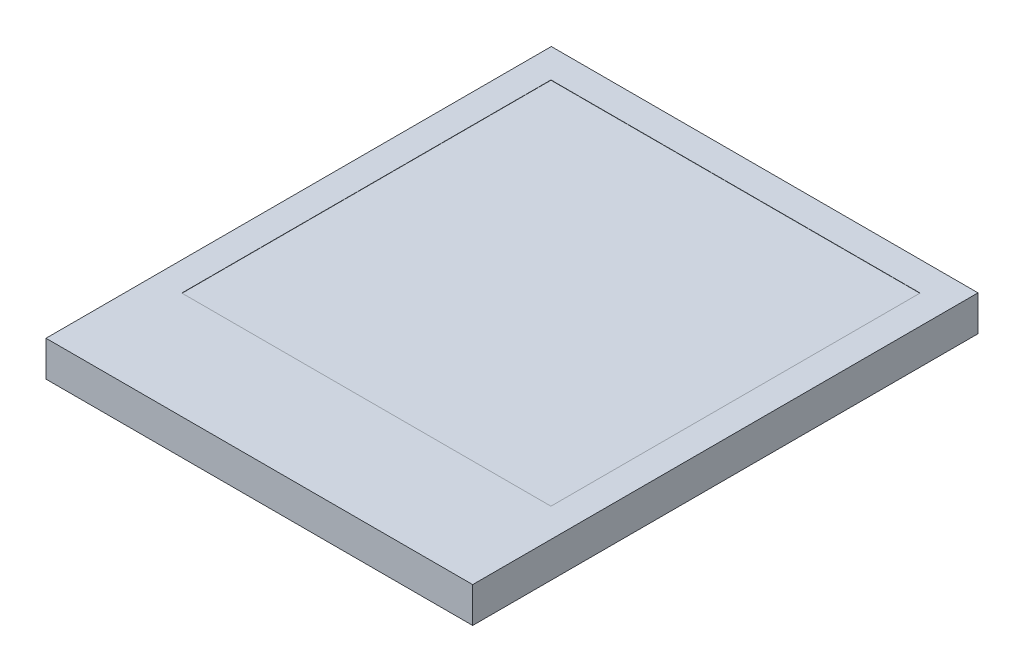
ISO-10303-21;
HEADER;
FILE_DESCRIPTION(('STEP AP214'),'2;1');
FILE_NAME('part.step','',(''),(''),'','','');
FILE_SCHEMA(('AUTOMOTIVE_DESIGN { 1 0 10303 214 1 1 1 1 }'));
ENDSEC;
DATA;
#1=APPLICATION_CONTEXT('core data for automotive mechanical design processes');
#2=APPLICATION_PROTOCOL_DEFINITION('international standard','automotive_design',2000,#1);
#3=PRODUCT_CONTEXT('',#1,'mechanical');
#4=PRODUCT('Part','Part','',(#3));
#5=PRODUCT_RELATED_PRODUCT_CATEGORY('part','',(#4));
#6=PRODUCT_DEFINITION_FORMATION('','',#4);
#7=PRODUCT_DEFINITION_CONTEXT('part definition',#1,'design');
#8=PRODUCT_DEFINITION('design','',#6,#7);
#9=PRODUCT_DEFINITION_SHAPE('','',#8);
#10=(LENGTH_UNIT() NAMED_UNIT(*) SI_UNIT(.MILLI.,.METRE.));
#11=(NAMED_UNIT(*) PLANE_ANGLE_UNIT() SI_UNIT($,.RADIAN.));
#12=(NAMED_UNIT(*) SI_UNIT($,.STERADIAN.) SOLID_ANGLE_UNIT());
#13=UNCERTAINTY_MEASURE_WITH_UNIT(LENGTH_MEASURE(1.E-05),#10,'distance_accuracy_value','');
#14=(GEOMETRIC_REPRESENTATION_CONTEXT(3) GLOBAL_UNCERTAINTY_ASSIGNED_CONTEXT((#13)) GLOBAL_UNIT_ASSIGNED_CONTEXT((#10,
#11,#12)) REPRESENTATION_CONTEXT('',''));
#15=CARTESIAN_POINT('',(0.,0.,0.));
#16=DIRECTION('',(0.,0.,1.));
#17=DIRECTION('',(1.,0.,0.));
#18=AXIS2_PLACEMENT_3D('',#15,#16,#17);
#19=CARTESIAN_POINT('',(0.,1.46,0.));
#20=DIRECTION('',(1.,0.,0.));
#21=DIRECTION('',(0.,0.,-1.));
#22=AXIS2_PLACEMENT_3D('',#19,#20,#21);
#23=PLANE('',#22);
#24=DIRECTION('',(0.,0.,1.));
#25=VECTOR('',#24,1.);
#26=CARTESIAN_POINT('',(0.,0.,0.));
#27=LINE('',#26,#25);
#28=CARTESIAN_POINT('',(0.,0.,-20.82));
#29=VERTEX_POINT('',#28);
#30=CARTESIAN_POINT('',(0.,0.,0.));
#31=VERTEX_POINT('',#30);
#32=EDGE_CURVE('E147',#29,#31,#27,.T.);
#33=ORIENTED_EDGE('',*,*,#32,.T.);
#34=DIRECTION('',(0.,-1.,0.));
#35=VECTOR('',#34,1.);
#36=CARTESIAN_POINT('',(0.,1.46,0.));
#37=LINE('',#36,#35);
#38=CARTESIAN_POINT('',(0.,1.46,0.));
#39=VERTEX_POINT('',#38);
#40=EDGE_CURVE('E11',#39,#31,#37,.T.);
#41=ORIENTED_EDGE('',*,*,#40,.F.);
#42=DIRECTION('',(0.,0.,1.));
#43=VECTOR('',#42,1.);
#44=CARTESIAN_POINT('',(0.,1.46,0.));
#45=LINE('',#44,#43);
#46=CARTESIAN_POINT('',(0.,1.46,-20.82));
#47=VERTEX_POINT('',#46);
#48=EDGE_CURVE('E151',#47,#39,#45,.T.);
#49=ORIENTED_EDGE('',*,*,#48,.F.);
#50=DIRECTION('',(0.,-1.,0.));
#51=VECTOR('',#50,1.);
#52=CARTESIAN_POINT('',(0.,1.46,-20.82));
#53=LINE('',#52,#51);
#54=EDGE_CURVE('E157',#47,#29,#53,.T.);
#55=ORIENTED_EDGE('',*,*,#54,.T.);
#56=EDGE_LOOP('',(#33,#41,#49,#55));
#57=FACE_BOUND('',#56,.T.);
#58=ADVANCED_FACE('F39',(#57),#23,.F.);
#59=CARTESIAN_POINT('',(0.,1.46,0.));
#60=DIRECTION('',(0.,0.,-1.));
#61=DIRECTION('',(-1.,0.,0.));
#62=AXIS2_PLACEMENT_3D('',#59,#60,#61);
#63=PLANE('',#62);
#64=DIRECTION('',(1.,0.,0.));
#65=VECTOR('',#64,1.);
#66=CARTESIAN_POINT('',(0.,0.,0.));
#67=LINE('',#66,#65);
#68=CARTESIAN_POINT('',(17.58,0.,0.));
#69=VERTEX_POINT('',#68);
#70=EDGE_CURVE('E160',#31,#69,#67,.T.);
#71=ORIENTED_EDGE('',*,*,#70,.T.);
#72=DIRECTION('',(0.,-1.,0.));
#73=VECTOR('',#72,1.);
#74=CARTESIAN_POINT('',(17.58,1.46,0.));
#75=LINE('',#74,#73);
#76=CARTESIAN_POINT('',(17.58,1.46,0.));
#77=VERTEX_POINT('',#76);
#78=EDGE_CURVE('E46',#77,#69,#75,.T.);
#79=ORIENTED_EDGE('',*,*,#78,.F.);
#80=DIRECTION('',(1.,0.,0.));
#81=VECTOR('',#80,1.);
#82=CARTESIAN_POINT('',(0.,1.46,0.));
#83=LINE('',#82,#81);
#84=EDGE_CURVE('E90',#39,#77,#83,.T.);
#85=ORIENTED_EDGE('',*,*,#84,.F.);
#86=ORIENTED_EDGE('',*,*,#40,.T.);
#87=EDGE_LOOP('',(#71,#79,#85,#86));
#88=FACE_BOUND('',#87,.T.);
#89=ADVANCED_FACE('F189',(#88),#63,.F.);
#90=CARTESIAN_POINT('',(17.58,1.46,0.));
#91=DIRECTION('',(-1.,0.,0.));
#92=DIRECTION('',(0.,0.,1.));
#93=AXIS2_PLACEMENT_3D('',#90,#91,#92);
#94=PLANE('',#93);
#95=DIRECTION('',(0.,0.,-1.));
#96=VECTOR('',#95,1.);
#97=CARTESIAN_POINT('',(17.58,0.,0.));
#98=LINE('',#97,#96);
#99=CARTESIAN_POINT('',(17.58,0.,-20.82));
#100=VERTEX_POINT('',#99);
#101=EDGE_CURVE('E162',#69,#100,#98,.T.);
#102=ORIENTED_EDGE('',*,*,#101,.T.);
#103=DIRECTION('',(0.,-1.,0.));
#104=VECTOR('',#103,1.);
#105=CARTESIAN_POINT('',(17.58,1.46,-20.82));
#106=LINE('',#105,#104);
#107=CARTESIAN_POINT('',(17.58,1.46,-20.82));
#108=VERTEX_POINT('',#107);
#109=EDGE_CURVE('E166',#108,#100,#106,.T.);
#110=ORIENTED_EDGE('',*,*,#109,.F.);
#111=DIRECTION('',(0.,0.,-1.));
#112=VECTOR('',#111,1.);
#113=CARTESIAN_POINT('',(17.58,1.46,0.));
#114=LINE('',#113,#112);
#115=EDGE_CURVE('E154',#77,#108,#114,.T.);
#116=ORIENTED_EDGE('',*,*,#115,.F.);
#117=ORIENTED_EDGE('',*,*,#78,.T.);
#118=EDGE_LOOP('',(#102,#110,#116,#117));
#119=FACE_BOUND('',#118,.T.);
#120=ADVANCED_FACE('F171',(#119),#94,.F.);
#121=CARTESIAN_POINT('',(0.,1.46,-20.82));
#122=DIRECTION('',(0.,0.,1.));
#123=DIRECTION('',(1.,0.,0.));
#124=AXIS2_PLACEMENT_3D('',#121,#122,#123);
#125=PLANE('',#124);
#126=DIRECTION('',(-1.,0.,0.));
#127=VECTOR('',#126,1.);
#128=CARTESIAN_POINT('',(0.,0.,-20.82));
#129=LINE('',#128,#127);
#130=EDGE_CURVE('E83',#100,#29,#129,.T.);
#131=ORIENTED_EDGE('',*,*,#130,.T.);
#132=ORIENTED_EDGE('',*,*,#54,.F.);
#133=DIRECTION('',(-1.,0.,0.));
#134=VECTOR('',#133,1.);
#135=CARTESIAN_POINT('',(0.,1.46,-20.82));
#136=LINE('',#135,#134);
#137=EDGE_CURVE('E62',#108,#47,#136,.T.);
#138=ORIENTED_EDGE('',*,*,#137,.F.);
#139=ORIENTED_EDGE('',*,*,#109,.T.);
#140=EDGE_LOOP('',(#131,#132,#138,#139));
#141=FACE_BOUND('',#140,.T.);
#142=ADVANCED_FACE('F179',(#141),#125,.F.);
#143=CARTESIAN_POINT('',(0.,1.46,0.));
#144=DIRECTION('',(0.,-1.,0.));
#145=DIRECTION('',(0.,0.,-1.));
#146=AXIS2_PLACEMENT_3D('',#143,#144,#145);
#147=PLANE('',#146);
#148=DIRECTION('',(1.,0.,0.));
#149=VECTOR('',#148,1.);
#150=CARTESIAN_POINT('',(1.185,1.46,-4.41));
#151=LINE('',#150,#149);
#152=CARTESIAN_POINT('',(1.185,1.46,-4.41));
#153=VERTEX_POINT('',#152);
#154=CARTESIAN_POINT('',(16.395,1.46,-4.41));
#155=VERTEX_POINT('',#154);
#156=EDGE_CURVE('E141',#153,#155,#151,.T.);
#157=ORIENTED_EDGE('',*,*,#156,.F.);
#158=DIRECTION('',(0.,0.,1.));
#159=VECTOR('',#158,1.);
#160=CARTESIAN_POINT('',(1.185,1.46,-19.62));
#161=LINE('',#160,#159);
#162=CARTESIAN_POINT('',(1.185,1.46,-19.62));
#163=VERTEX_POINT('',#162);
#164=EDGE_CURVE('E53',#163,#153,#161,.T.);
#165=ORIENTED_EDGE('',*,*,#164,.F.);
#166=DIRECTION('',(-1.,0.,0.));
#167=VECTOR('',#166,1.);
#168=CARTESIAN_POINT('',(1.185,1.46,-19.62));
#169=LINE('',#168,#167);
#170=CARTESIAN_POINT('',(16.395,1.46,-19.62));
#171=VERTEX_POINT('',#170);
#172=EDGE_CURVE('E132',#171,#163,#169,.T.);
#173=ORIENTED_EDGE('',*,*,#172,.F.);
#174=DIRECTION('',(0.,0.,-1.));
#175=VECTOR('',#174,1.);
#176=CARTESIAN_POINT('',(16.395,1.46,-19.62));
#177=LINE('',#176,#175);
#178=EDGE_CURVE('E135',#155,#171,#177,.T.);
#179=ORIENTED_EDGE('',*,*,#178,.F.);
#180=EDGE_LOOP('',(#157,#165,#173,#179));
#181=FACE_BOUND('',#180,.T.);
#182=ORIENTED_EDGE('',*,*,#48,.T.);
#183=ORIENTED_EDGE('',*,*,#84,.T.);
#184=ORIENTED_EDGE('',*,*,#115,.T.);
#185=ORIENTED_EDGE('',*,*,#137,.T.);
#186=EDGE_LOOP('',(#182,#183,#184,#185));
#187=FACE_BOUND('',#186,.T.);
#188=ADVANCED_FACE('F181',(#181,#187),#147,.F.);
#189=CARTESIAN_POINT('',(0.,0.,0.));
#190=DIRECTION('',(0.,-1.,0.));
#191=DIRECTION('',(0.,0.,-1.));
#192=AXIS2_PLACEMENT_3D('',#189,#190,#191);
#193=PLANE('',#192);
#194=ORIENTED_EDGE('',*,*,#32,.F.);
#195=ORIENTED_EDGE('',*,*,#130,.F.);
#196=ORIENTED_EDGE('',*,*,#101,.F.);
#197=ORIENTED_EDGE('',*,*,#70,.F.);
#198=EDGE_LOOP('',(#194,#195,#196,#197));
#199=FACE_BOUND('',#198,.T.);
#200=ADVANCED_FACE('F175',(#199),#193,.T.);
#201=CARTESIAN_POINT('',(1.185,1.45,-19.62));
#202=DIRECTION('',(-1.,0.,0.));
#203=DIRECTION('',(0.,0.,1.));
#204=AXIS2_PLACEMENT_3D('',#201,#202,#203);
#205=PLANE('',#204);
#206=ORIENTED_EDGE('',*,*,#164,.T.);
#207=DIRECTION('',(0.,1.,0.));
#208=VECTOR('',#207,1.);
#209=CARTESIAN_POINT('',(1.185,1.45,-4.41));
#210=LINE('',#209,#208);
#211=CARTESIAN_POINT('',(1.185,1.45,-4.41));
#212=VERTEX_POINT('',#211);
#213=EDGE_CURVE('E110',#212,#153,#210,.T.);
#214=ORIENTED_EDGE('',*,*,#213,.F.);
#215=DIRECTION('',(0.,0.,1.));
#216=VECTOR('',#215,1.);
#217=CARTESIAN_POINT('',(1.185,1.45,-19.62));
#218=LINE('',#217,#216);
#219=CARTESIAN_POINT('',(1.185,1.45,-19.62));
#220=VERTEX_POINT('',#219);
#221=EDGE_CURVE('E114',#220,#212,#218,.T.);
#222=ORIENTED_EDGE('',*,*,#221,.F.);
#223=DIRECTION('',(0.,1.,0.));
#224=VECTOR('',#223,1.);
#225=CARTESIAN_POINT('',(1.185,1.45,-19.62));
#226=LINE('',#225,#224);
#227=EDGE_CURVE('E145',#220,#163,#226,.T.);
#228=ORIENTED_EDGE('',*,*,#227,.T.);
#229=EDGE_LOOP('',(#206,#214,#222,#228));
#230=FACE_BOUND('',#229,.T.);
#231=ADVANCED_FACE('F112',(#230),#205,.F.);
#232=CARTESIAN_POINT('',(1.185,1.45,-19.62));
#233=DIRECTION('',(0.,0.,-1.));
#234=DIRECTION('',(-1.,0.,0.));
#235=AXIS2_PLACEMENT_3D('',#232,#233,#234);
#236=PLANE('',#235);
#237=ORIENTED_EDGE('',*,*,#172,.T.);
#238=ORIENTED_EDGE('',*,*,#227,.F.);
#239=DIRECTION('',(-1.,0.,0.));
#240=VECTOR('',#239,1.);
#241=CARTESIAN_POINT('',(1.185,1.45,-19.62));
#242=LINE('',#241,#240);
#243=CARTESIAN_POINT('',(16.395,1.45,-19.62));
#244=VERTEX_POINT('',#243);
#245=EDGE_CURVE('E120',#244,#220,#242,.T.);
#246=ORIENTED_EDGE('',*,*,#245,.F.);
#247=DIRECTION('',(0.,1.,0.));
#248=VECTOR('',#247,1.);
#249=CARTESIAN_POINT('',(16.395,1.45,-19.62));
#250=LINE('',#249,#248);
#251=EDGE_CURVE('E148',#244,#171,#250,.T.);
#252=ORIENTED_EDGE('',*,*,#251,.T.);
#253=EDGE_LOOP('',(#237,#238,#246,#252));
#254=FACE_BOUND('',#253,.T.);
#255=ADVANCED_FACE('F232',(#254),#236,.F.);
#256=CARTESIAN_POINT('',(16.395,1.45,-19.62));
#257=DIRECTION('',(1.,0.,0.));
#258=DIRECTION('',(0.,0.,-1.));
#259=AXIS2_PLACEMENT_3D('',#256,#257,#258);
#260=PLANE('',#259);
#261=ORIENTED_EDGE('',*,*,#178,.T.);
#262=ORIENTED_EDGE('',*,*,#251,.F.);
#263=DIRECTION('',(0.,0.,-1.));
#264=VECTOR('',#263,1.);
#265=CARTESIAN_POINT('',(16.395,1.45,-19.62));
#266=LINE('',#265,#264);
#267=CARTESIAN_POINT('',(16.395,1.45,-4.41));
#268=VERTEX_POINT('',#267);
#269=EDGE_CURVE('E128',#268,#244,#266,.T.);
#270=ORIENTED_EDGE('',*,*,#269,.F.);
#271=DIRECTION('',(0.,1.,0.));
#272=VECTOR('',#271,1.);
#273=CARTESIAN_POINT('',(16.395,1.45,-4.41));
#274=LINE('',#273,#272);
#275=EDGE_CURVE('E119',#268,#155,#274,.T.);
#276=ORIENTED_EDGE('',*,*,#275,.T.);
#277=EDGE_LOOP('',(#261,#262,#270,#276));
#278=FACE_BOUND('',#277,.T.);
#279=ADVANCED_FACE('F242',(#278),#260,.F.);
#280=CARTESIAN_POINT('',(1.185,1.45,-4.41));
#281=DIRECTION('',(0.,0.,1.));
#282=DIRECTION('',(1.,0.,0.));
#283=AXIS2_PLACEMENT_3D('',#280,#281,#282);
#284=PLANE('',#283);
#285=ORIENTED_EDGE('',*,*,#156,.T.);
#286=ORIENTED_EDGE('',*,*,#275,.F.);
#287=DIRECTION('',(1.,0.,0.));
#288=VECTOR('',#287,1.);
#289=CARTESIAN_POINT('',(1.185,1.45,-4.41));
#290=LINE('',#289,#288);
#291=EDGE_CURVE('E123',#212,#268,#290,.T.);
#292=ORIENTED_EDGE('',*,*,#291,.F.);
#293=ORIENTED_EDGE('',*,*,#213,.T.);
#294=EDGE_LOOP('',(#285,#286,#292,#293));
#295=FACE_BOUND('',#294,.T.);
#296=ADVANCED_FACE('F124',(#295),#284,.F.);
#297=CARTESIAN_POINT('',(0.,1.45,0.));
#298=DIRECTION('',(0.,1.,0.));
#299=DIRECTION('',(0.,0.,1.));
#300=AXIS2_PLACEMENT_3D('',#297,#298,#299);
#301=PLANE('',#300);
#302=ORIENTED_EDGE('',*,*,#221,.T.);
#303=ORIENTED_EDGE('',*,*,#291,.T.);
#304=ORIENTED_EDGE('',*,*,#269,.T.);
#305=ORIENTED_EDGE('',*,*,#245,.T.);
#306=EDGE_LOOP('',(#302,#303,#304,#305));
#307=FACE_BOUND('',#306,.T.);
#308=ADVANCED_FACE('F130',(#307),#301,.T.);
#309=CLOSED_SHELL('',(#58,#89,#120,#142,#188,#200,#231,#255,#279,#296,#308));
#310=MANIFOLD_SOLID_BREP('B2',#309);
#311=ADVANCED_BREP_SHAPE_REPRESENTATION('',(#18,#310),#14);
#312=SHAPE_DEFINITION_REPRESENTATION(#9,#311);
ENDSEC;
END-ISO-10303-21;
